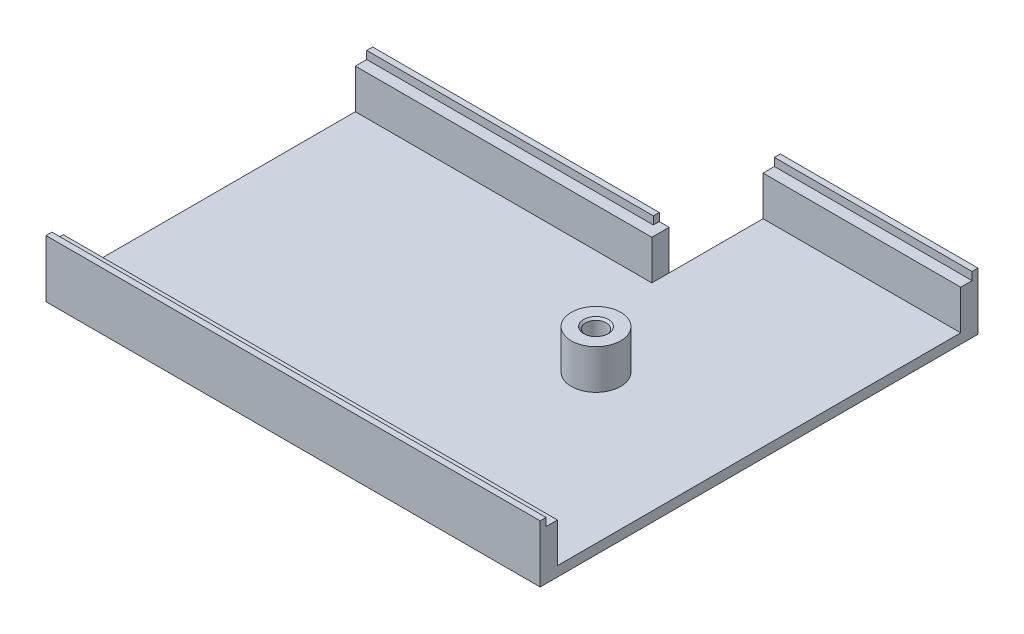
ISO-10303-21;
HEADER;
FILE_DESCRIPTION(('STEP AP214'),'2;1');
FILE_NAME('part.step','',(''),(''),'','','');
FILE_SCHEMA(('AUTOMOTIVE_DESIGN { 1 0 10303 214 1 1 1 1 }'));
ENDSEC;
DATA;
#1=APPLICATION_CONTEXT('core data for automotive mechanical design processes');
#2=APPLICATION_PROTOCOL_DEFINITION('international standard','automotive_design',2000,#1);
#3=PRODUCT_CONTEXT('',#1,'mechanical');
#4=PRODUCT('Part','Part','',(#3));
#5=PRODUCT_RELATED_PRODUCT_CATEGORY('part','',(#4));
#6=PRODUCT_DEFINITION_FORMATION('','',#4);
#7=PRODUCT_DEFINITION_CONTEXT('part definition',#1,'design');
#8=PRODUCT_DEFINITION('design','',#6,#7);
#9=PRODUCT_DEFINITION_SHAPE('','',#8);
#10=(LENGTH_UNIT() NAMED_UNIT(*) SI_UNIT(.MILLI.,.METRE.));
#11=(NAMED_UNIT(*) PLANE_ANGLE_UNIT() SI_UNIT($,.RADIAN.));
#12=(NAMED_UNIT(*) SI_UNIT($,.STERADIAN.) SOLID_ANGLE_UNIT());
#13=UNCERTAINTY_MEASURE_WITH_UNIT(LENGTH_MEASURE(1.E-05),#10,'distance_accuracy_value','');
#14=(GEOMETRIC_REPRESENTATION_CONTEXT(3) GLOBAL_UNCERTAINTY_ASSIGNED_CONTEXT((#13)) GLOBAL_UNIT_ASSIGNED_CONTEXT((#10,
#11,#12)) REPRESENTATION_CONTEXT('',''));
#15=CARTESIAN_POINT('',(0.,0.,0.));
#16=DIRECTION('',(0.,0.,1.));
#17=DIRECTION('',(1.,0.,0.));
#18=AXIS2_PLACEMENT_3D('',#15,#16,#17);
#19=CARTESIAN_POINT('',(0.,10.,0.));
#20=DIRECTION('',(0.,-1.,0.));
#21=DIRECTION('',(0.,0.,-1.));
#22=AXIS2_PLACEMENT_3D('',#19,#20,#21);
#23=PLANE('',#22);
#24=DIRECTION('',(-1.,0.,0.));
#25=VECTOR('',#24,1.);
#26=CARTESIAN_POINT('',(0.,10.,-1.20000000000001));
#27=LINE('',#26,#25);
#28=CARTESIAN_POINT('',(100.,10.,-1.20000000000001));
#29=VERTEX_POINT('',#28);
#30=CARTESIAN_POINT('',(0.,10.,-1.20000000000001));
#31=VERTEX_POINT('',#30);
#32=EDGE_CURVE('E57',#29,#31,#27,.T.);
#33=ORIENTED_EDGE('',*,*,#32,.F.);
#34=DIRECTION('',(0.,0.,-1.));
#35=VECTOR('',#34,1.);
#36=CARTESIAN_POINT('',(100.,10.,0.));
#37=LINE('',#36,#35);
#38=CARTESIAN_POINT('',(100.,10.,-3.5));
#39=VERTEX_POINT('',#38);
#40=EDGE_CURVE('E182',#29,#39,#37,.T.);
#41=ORIENTED_EDGE('',*,*,#40,.T.);
#42=DIRECTION('',(-1.,0.,0.));
#43=VECTOR('',#42,1.);
#44=CARTESIAN_POINT('',(0.,10.,-3.5));
#45=LINE('',#44,#43);
#46=CARTESIAN_POINT('',(0.,10.,-3.5));
#47=VERTEX_POINT('',#46);
#48=EDGE_CURVE('E176',#39,#47,#45,.T.);
#49=ORIENTED_EDGE('',*,*,#48,.T.);
#50=DIRECTION('',(0.,0.,1.));
#51=VECTOR('',#50,1.);
#52=CARTESIAN_POINT('',(0.,10.,0.));
#53=LINE('',#52,#51);
#54=EDGE_CURVE('E174',#47,#31,#53,.T.);
#55=ORIENTED_EDGE('',*,*,#54,.T.);
#56=EDGE_LOOP('',(#33,#41,#49,#55));
#57=FACE_BOUND('',#56,.T.);
#58=ADVANCED_FACE('F41',(#57),#23,.F.);
#59=CARTESIAN_POINT('',(0.,10.,0.));
#60=DIRECTION('',(0.,1.,0.));
#61=DIRECTION('',(0.,0.,1.));
#62=AXIS2_PLACEMENT_3D('',#59,#60,#61);
#63=PLANE('',#62);
#64=DIRECTION('',(0.,0.,-1.));
#65=VECTOR('',#64,1.);
#66=CARTESIAN_POINT('',(100.,10.,-88.6));
#67=LINE('',#66,#65);
#68=CARTESIAN_POINT('',(100.,10.,-85.1));
#69=VERTEX_POINT('',#68);
#70=CARTESIAN_POINT('',(100.,10.,-87.4));
#71=VERTEX_POINT('',#70);
#72=EDGE_CURVE('E65',#69,#71,#67,.T.);
#73=ORIENTED_EDGE('',*,*,#72,.T.);
#74=DIRECTION('',(1.,0.,0.));
#75=VECTOR('',#74,1.);
#76=CARTESIAN_POINT('',(60.,10.,-87.4));
#77=LINE('',#76,#75);
#78=CARTESIAN_POINT('',(60.,10.,-87.4));
#79=VERTEX_POINT('',#78);
#80=EDGE_CURVE('E215',#79,#71,#77,.T.);
#81=ORIENTED_EDGE('',*,*,#80,.F.);
#82=DIRECTION('',(0.,0.,1.));
#83=VECTOR('',#82,1.);
#84=CARTESIAN_POINT('',(60.,10.,-88.6));
#85=LINE('',#84,#83);
#86=CARTESIAN_POINT('',(60.,10.,-85.1));
#87=VERTEX_POINT('',#86);
#88=EDGE_CURVE('E280',#79,#87,#85,.T.);
#89=ORIENTED_EDGE('',*,*,#88,.T.);
#90=DIRECTION('',(1.,0.,0.));
#91=VECTOR('',#90,1.);
#92=CARTESIAN_POINT('',(60.,10.,-85.1));
#93=LINE('',#92,#91);
#94=EDGE_CURVE('E282',#87,#69,#93,.T.);
#95=ORIENTED_EDGE('',*,*,#94,.T.);
#96=EDGE_LOOP('',(#73,#81,#89,#95));
#97=FACE_BOUND('',#96,.T.);
#98=ADVANCED_FACE('F364',(#97),#63,.T.);
#99=CARTESIAN_POINT('',(0.,10.,0.));
#100=DIRECTION('',(0.,1.,0.));
#101=DIRECTION('',(0.,0.,1.));
#102=AXIS2_PLACEMENT_3D('',#99,#100,#101);
#103=PLANE('',#102);
#104=DIRECTION('',(0.,0.,-1.));
#105=VECTOR('',#104,1.);
#106=CARTESIAN_POINT('',(58.,10.,-66.1));
#107=LINE('',#106,#105);
#108=CARTESIAN_POINT('',(58.,10.,-64.9));
#109=VERTEX_POINT('',#108);
#110=CARTESIAN_POINT('',(58.,10.,-66.1));
#111=VERTEX_POINT('',#110);
#112=EDGE_CURVE('E232',#109,#111,#107,.T.);
#113=ORIENTED_EDGE('',*,*,#112,.F.);
#114=DIRECTION('',(1.,0.,0.));
#115=VECTOR('',#114,1.);
#116=CARTESIAN_POINT('',(0.,10.,-64.9));
#117=LINE('',#116,#115);
#118=CARTESIAN_POINT('',(0.,10.,-64.9));
#119=VERTEX_POINT('',#118);
#120=EDGE_CURVE('E217',#119,#109,#117,.T.);
#121=ORIENTED_EDGE('',*,*,#120,.F.);
#122=DIRECTION('',(0.,0.,1.));
#123=VECTOR('',#122,1.);
#124=CARTESIAN_POINT('',(0.,10.,-66.1));
#125=LINE('',#124,#123);
#126=CARTESIAN_POINT('',(0.,10.,-62.6));
#127=VERTEX_POINT('',#126);
#128=EDGE_CURVE('E285',#119,#127,#125,.T.);
#129=ORIENTED_EDGE('',*,*,#128,.T.);
#130=DIRECTION('',(1.,0.,0.));
#131=VECTOR('',#130,1.);
#132=CARTESIAN_POINT('',(0.,10.,-62.6));
#133=LINE('',#132,#131);
#134=CARTESIAN_POINT('',(60.,10.,-62.6));
#135=VERTEX_POINT('',#134);
#136=EDGE_CURVE('E287',#127,#135,#133,.T.);
#137=ORIENTED_EDGE('',*,*,#136,.T.);
#138=DIRECTION('',(0.,0.,-1.));
#139=VECTOR('',#138,1.);
#140=CARTESIAN_POINT('',(60.,10.,-66.1));
#141=LINE('',#140,#139);
#142=CARTESIAN_POINT('',(60.,10.,-66.1));
#143=VERTEX_POINT('',#142);
#144=EDGE_CURVE('E290',#135,#143,#141,.T.);
#145=ORIENTED_EDGE('',*,*,#144,.T.);
#146=DIRECTION('',(-1.,0.,0.));
#147=VECTOR('',#146,1.);
#148=CARTESIAN_POINT('',(0.,10.,-66.1));
#149=LINE('',#148,#147);
#150=EDGE_CURVE('E292',#143,#111,#149,.T.);
#151=ORIENTED_EDGE('',*,*,#150,.T.);
#152=EDGE_LOOP('',(#113,#121,#129,#137,#145,#151));
#153=FACE_BOUND('',#152,.T.);
#154=ADVANCED_FACE('F369',(#153),#103,.T.);
#155=CARTESIAN_POINT('',(0.,2.,0.));
#156=DIRECTION('',(0.,1.,0.));
#157=DIRECTION('',(0.,0.,1.));
#158=AXIS2_PLACEMENT_3D('',#155,#156,#157);
#159=PLANE('',#158);
#160=CARTESIAN_POINT('',(70.,2.,-41.3));
#161=DIRECTION('',(0.,1.,0.));
#162=DIRECTION('',(0.,0.,1.));
#163=AXIS2_PLACEMENT_3D('',#160,#161,#162);
#164=CIRCLE('',#163,5.00000000000001);
#165=CARTESIAN_POINT('',(70.,2.,-36.3));
#166=VERTEX_POINT('',#165);
#167=EDGE_CURVE('E256',#166,#166,#164,.T.);
#168=ORIENTED_EDGE('',*,*,#167,.F.);
#169=EDGE_LOOP('',(#168));
#170=FACE_BOUND('',#169,.T.);
#171=DIRECTION('',(0.,0.,1.));
#172=VECTOR('',#171,1.);
#173=CARTESIAN_POINT('',(0.,2.,-66.1));
#174=LINE('',#173,#172);
#175=CARTESIAN_POINT('',(0.,2.,-62.6));
#176=VERTEX_POINT('',#175);
#177=CARTESIAN_POINT('',(0.,2.,-3.5));
#178=VERTEX_POINT('',#177);
#179=EDGE_CURVE('E308',#176,#178,#174,.T.);
#180=ORIENTED_EDGE('',*,*,#179,.T.);
#181=DIRECTION('',(-1.,0.,0.));
#182=VECTOR('',#181,1.);
#183=CARTESIAN_POINT('',(0.,2.,-3.5));
#184=LINE('',#183,#182);
#185=CARTESIAN_POINT('',(100.,2.,-3.5));
#186=VERTEX_POINT('',#185);
#187=EDGE_CURVE('E181',#186,#178,#184,.T.);
#188=ORIENTED_EDGE('',*,*,#187,.F.);
#189=DIRECTION('',(0.,0.,-1.));
#190=VECTOR('',#189,1.);
#191=CARTESIAN_POINT('',(100.,2.,0.));
#192=LINE('',#191,#190);
#193=CARTESIAN_POINT('',(100.,2.,-85.1));
#194=VERTEX_POINT('',#193);
#195=EDGE_CURVE('E310',#186,#194,#192,.T.);
#196=ORIENTED_EDGE('',*,*,#195,.T.);
#197=DIRECTION('',(1.,0.,0.));
#198=VECTOR('',#197,1.);
#199=CARTESIAN_POINT('',(60.,2.,-85.1));
#200=LINE('',#199,#198);
#201=CARTESIAN_POINT('',(60.,2.,-85.1));
#202=VERTEX_POINT('',#201);
#203=EDGE_CURVE('E276',#202,#194,#200,.T.);
#204=ORIENTED_EDGE('',*,*,#203,.F.);
#205=DIRECTION('',(0.,0.,1.));
#206=VECTOR('',#205,1.);
#207=CARTESIAN_POINT('',(60.,2.,-88.6));
#208=LINE('',#207,#206);
#209=CARTESIAN_POINT('',(60.,2.,-66.1));
#210=VERTEX_POINT('',#209);
#211=EDGE_CURVE('E313',#202,#210,#208,.T.);
#212=ORIENTED_EDGE('',*,*,#211,.T.);
#213=DIRECTION('',(0.,0.,-1.));
#214=VECTOR('',#213,1.);
#215=CARTESIAN_POINT('',(60.,2.,-66.1));
#216=LINE('',#215,#214);
#217=CARTESIAN_POINT('',(60.,2.,-62.6));
#218=VERTEX_POINT('',#217);
#219=EDGE_CURVE('E288',#218,#210,#216,.T.);
#220=ORIENTED_EDGE('',*,*,#219,.F.);
#221=DIRECTION('',(1.,0.,0.));
#222=VECTOR('',#221,1.);
#223=CARTESIAN_POINT('',(0.,2.,-62.6));
#224=LINE('',#223,#222);
#225=EDGE_CURVE('E279',#176,#218,#224,.T.);
#226=ORIENTED_EDGE('',*,*,#225,.F.);
#227=EDGE_LOOP('',(#180,#188,#196,#204,#212,#220,#226));
#228=FACE_BOUND('',#227,.T.);
#229=ADVANCED_FACE('F382',(#170,#228),#159,.T.);
#230=CARTESIAN_POINT('',(60.,2.,-66.1));
#231=DIRECTION('',(0.,0.,1.));
#232=DIRECTION('',(1.,0.,0.));
#233=AXIS2_PLACEMENT_3D('',#230,#231,#232);
#234=PLANE('',#233);
#235=DIRECTION('',(-1.,0.,0.));
#236=VECTOR('',#235,1.);
#237=CARTESIAN_POINT('',(60.,0.,-66.1));
#238=LINE('',#237,#236);
#239=CARTESIAN_POINT('',(60.,0.,-66.1));
#240=VERTEX_POINT('',#239);
#241=CARTESIAN_POINT('',(0.,0.,-66.1));
#242=VERTEX_POINT('',#241);
#243=EDGE_CURVE('E307',#240,#242,#238,.T.);
#244=ORIENTED_EDGE('',*,*,#243,.T.);
#245=DIRECTION('',(0.,-1.,0.));
#246=VECTOR('',#245,1.);
#247=CARTESIAN_POINT('',(0.,2.,-66.1));
#248=LINE('',#247,#246);
#249=CARTESIAN_POINT('',(0.,11.6,-66.1));
#250=VERTEX_POINT('',#249);
#251=EDGE_CURVE('E341',#250,#242,#248,.T.);
#252=ORIENTED_EDGE('',*,*,#251,.F.);
#253=DIRECTION('',(-1.,0.,0.));
#254=VECTOR('',#253,1.);
#255=CARTESIAN_POINT('',(0.,11.6,-66.1));
#256=LINE('',#255,#254);
#257=CARTESIAN_POINT('',(58.,11.6,-66.1));
#258=VERTEX_POINT('',#257);
#259=EDGE_CURVE('E236',#258,#250,#256,.T.);
#260=ORIENTED_EDGE('',*,*,#259,.F.);
#261=DIRECTION('',(0.,-1.,0.));
#262=VECTOR('',#261,1.);
#263=CARTESIAN_POINT('',(58.,11.6,-66.1));
#264=LINE('',#263,#262);
#265=EDGE_CURVE('E239',#258,#111,#264,.T.);
#266=ORIENTED_EDGE('',*,*,#265,.T.);
#267=ORIENTED_EDGE('',*,*,#150,.F.);
#268=DIRECTION('',(0.,-1.,0.));
#269=VECTOR('',#268,1.);
#270=CARTESIAN_POINT('',(60.,10.,-66.1));
#271=LINE('',#270,#269);
#272=EDGE_CURVE('E294',#143,#210,#271,.T.);
#273=ORIENTED_EDGE('',*,*,#272,.T.);
#274=DIRECTION('',(0.,-1.,0.));
#275=VECTOR('',#274,1.);
#276=CARTESIAN_POINT('',(60.,2.,-66.1));
#277=LINE('',#276,#275);
#278=EDGE_CURVE('E315',#210,#240,#277,.T.);
#279=ORIENTED_EDGE('',*,*,#278,.T.);
#280=EDGE_LOOP('',(#244,#252,#260,#266,#267,#273,#279));
#281=FACE_BOUND('',#280,.T.);
#282=ADVANCED_FACE('F394',(#281),#234,.F.);
#283=CARTESIAN_POINT('',(0.,2.,-66.1));
#284=DIRECTION('',(1.,0.,0.));
#285=DIRECTION('',(0.,0.,-1.));
#286=AXIS2_PLACEMENT_3D('',#283,#284,#285);
#287=PLANE('',#286);
#288=DIRECTION('',(0.,0.,1.));
#289=VECTOR('',#288,1.);
#290=CARTESIAN_POINT('',(0.,0.,-66.1));
#291=LINE('',#290,#289);
#292=CARTESIAN_POINT('',(0.,0.,0.));
#293=VERTEX_POINT('',#292);
#294=EDGE_CURVE('E318',#242,#293,#291,.T.);
#295=ORIENTED_EDGE('',*,*,#294,.T.);
#296=DIRECTION('',(0.,-1.,0.));
#297=VECTOR('',#296,1.);
#298=CARTESIAN_POINT('',(0.,2.,0.));
#299=LINE('',#298,#297);
#300=CARTESIAN_POINT('',(0.,11.6,0.));
#301=VERTEX_POINT('',#300);
#302=EDGE_CURVE('E338',#301,#293,#299,.T.);
#303=ORIENTED_EDGE('',*,*,#302,.F.);
#304=DIRECTION('',(0.,0.,1.));
#305=VECTOR('',#304,1.);
#306=CARTESIAN_POINT('',(0.,11.6,0.));
#307=LINE('',#306,#305);
#308=CARTESIAN_POINT('',(0.,11.6,-1.20000000000001));
#309=VERTEX_POINT('',#308);
#310=EDGE_CURVE('E194',#309,#301,#307,.T.);
#311=ORIENTED_EDGE('',*,*,#310,.F.);
#312=DIRECTION('',(0.,-1.,0.));
#313=VECTOR('',#312,1.);
#314=CARTESIAN_POINT('',(0.,11.6,-1.20000000000001));
#315=LINE('',#314,#313);
#316=EDGE_CURVE('E189',#309,#31,#315,.T.);
#317=ORIENTED_EDGE('',*,*,#316,.T.);
#318=ORIENTED_EDGE('',*,*,#54,.F.);
#319=DIRECTION('',(0.,-1.,0.));
#320=VECTOR('',#319,1.);
#321=CARTESIAN_POINT('',(0.,10.,-3.5));
#322=LINE('',#321,#320);
#323=EDGE_CURVE('E264',#47,#178,#322,.T.);
#324=ORIENTED_EDGE('',*,*,#323,.T.);
#325=ORIENTED_EDGE('',*,*,#179,.F.);
#326=DIRECTION('',(0.,-1.,0.));
#327=VECTOR('',#326,1.);
#328=CARTESIAN_POINT('',(0.,10.,-62.6));
#329=LINE('',#328,#327);
#330=EDGE_CURVE('E304',#127,#176,#329,.T.);
#331=ORIENTED_EDGE('',*,*,#330,.F.);
#332=ORIENTED_EDGE('',*,*,#128,.F.);
#333=DIRECTION('',(0.,-1.,0.));
#334=VECTOR('',#333,1.);
#335=CARTESIAN_POINT('',(0.,11.6,-64.9));
#336=LINE('',#335,#334);
#337=CARTESIAN_POINT('',(0.,11.6,-64.9));
#338=VERTEX_POINT('',#337);
#339=EDGE_CURVE('E249',#338,#119,#336,.T.);
#340=ORIENTED_EDGE('',*,*,#339,.F.);
#341=DIRECTION('',(0.,0.,1.));
#342=VECTOR('',#341,1.);
#343=CARTESIAN_POINT('',(0.,11.6,-66.1));
#344=LINE('',#343,#342);
#345=EDGE_CURVE('E228',#250,#338,#344,.T.);
#346=ORIENTED_EDGE('',*,*,#345,.F.);
#347=ORIENTED_EDGE('',*,*,#251,.T.);
#348=EDGE_LOOP('',(#295,#303,#311,#317,#318,#324,#325,#331,#332,#340,#346,#347));
#349=FACE_BOUND('',#348,.T.);
#350=ADVANCED_FACE('F196',(#349),#287,.F.);
#351=CARTESIAN_POINT('',(0.,2.,0.));
#352=DIRECTION('',(0.,0.,-1.));
#353=DIRECTION('',(-1.,0.,0.));
#354=AXIS2_PLACEMENT_3D('',#351,#352,#353);
#355=PLANE('',#354);
#356=DIRECTION('',(1.,0.,0.));
#357=VECTOR('',#356,1.);
#358=CARTESIAN_POINT('',(0.,0.,0.));
#359=LINE('',#358,#357);
#360=CARTESIAN_POINT('',(100.,0.,0.));
#361=VERTEX_POINT('',#360);
#362=EDGE_CURVE('E320',#293,#361,#359,.T.);
#363=ORIENTED_EDGE('',*,*,#362,.T.);
#364=DIRECTION('',(0.,-1.,0.));
#365=VECTOR('',#364,1.);
#366=CARTESIAN_POINT('',(100.,2.,0.));
#367=LINE('',#366,#365);
#368=CARTESIAN_POINT('',(100.,11.6,0.));
#369=VERTEX_POINT('',#368);
#370=EDGE_CURVE('E335',#369,#361,#367,.T.);
#371=ORIENTED_EDGE('',*,*,#370,.F.);
#372=DIRECTION('',(1.,0.,0.));
#373=VECTOR('',#372,1.);
#374=CARTESIAN_POINT('',(0.,11.6,0.));
#375=LINE('',#374,#373);
#376=EDGE_CURVE('E205',#301,#369,#375,.T.);
#377=ORIENTED_EDGE('',*,*,#376,.F.);
#378=ORIENTED_EDGE('',*,*,#302,.T.);
#379=EDGE_LOOP('',(#363,#371,#377,#378));
#380=FACE_BOUND('',#379,.T.);
#381=ADVANCED_FACE('F410',(#380),#355,.F.);
#382=CARTESIAN_POINT('',(100.,2.,0.));
#383=DIRECTION('',(-1.,0.,0.));
#384=DIRECTION('',(0.,0.,1.));
#385=AXIS2_PLACEMENT_3D('',#382,#383,#384);
#386=PLANE('',#385);
#387=DIRECTION('',(0.,0.,-1.));
#388=VECTOR('',#387,1.);
#389=CARTESIAN_POINT('',(100.,0.,0.));
#390=LINE('',#389,#388);
#391=CARTESIAN_POINT('',(100.,0.,-88.6));
#392=VERTEX_POINT('',#391);
#393=EDGE_CURVE('E322',#361,#392,#390,.T.);
#394=ORIENTED_EDGE('',*,*,#393,.T.);
#395=DIRECTION('',(0.,-1.,0.));
#396=VECTOR('',#395,1.);
#397=CARTESIAN_POINT('',(100.,2.,-88.6));
#398=LINE('',#397,#396);
#399=CARTESIAN_POINT('',(100.,11.6,-88.6));
#400=VERTEX_POINT('',#399);
#401=EDGE_CURVE('E332',#400,#392,#398,.T.);
#402=ORIENTED_EDGE('',*,*,#401,.F.);
#403=DIRECTION('',(0.,0.,-1.));
#404=VECTOR('',#403,1.);
#405=CARTESIAN_POINT('',(100.,11.6,-88.6));
#406=LINE('',#405,#404);
#407=CARTESIAN_POINT('',(100.,11.6,-87.4));
#408=VERTEX_POINT('',#407);
#409=EDGE_CURVE('E221',#408,#400,#406,.T.);
#410=ORIENTED_EDGE('',*,*,#409,.F.);
#411=DIRECTION('',(0.,-1.,0.));
#412=VECTOR('',#411,1.);
#413=CARTESIAN_POINT('',(100.,11.6,-87.4));
#414=LINE('',#413,#412);
#415=EDGE_CURVE('E211',#408,#71,#414,.T.);
#416=ORIENTED_EDGE('',*,*,#415,.T.);
#417=ORIENTED_EDGE('',*,*,#72,.F.);
#418=DIRECTION('',(0.,-1.,0.));
#419=VECTOR('',#418,1.);
#420=CARTESIAN_POINT('',(100.,10.,-85.1));
#421=LINE('',#420,#419);
#422=EDGE_CURVE('E273',#69,#194,#421,.T.);
#423=ORIENTED_EDGE('',*,*,#422,.T.);
#424=ORIENTED_EDGE('',*,*,#195,.F.);
#425=DIRECTION('',(0.,-1.,0.));
#426=VECTOR('',#425,1.);
#427=CARTESIAN_POINT('',(100.,10.,-3.5));
#428=LINE('',#427,#426);
#429=EDGE_CURVE('E259',#39,#186,#428,.T.);
#430=ORIENTED_EDGE('',*,*,#429,.F.);
#431=ORIENTED_EDGE('',*,*,#40,.F.);
#432=DIRECTION('',(0.,-1.,0.));
#433=VECTOR('',#432,1.);
#434=CARTESIAN_POINT('',(100.,11.6,-1.20000000000001));
#435=LINE('',#434,#433);
#436=CARTESIAN_POINT('',(100.,11.6,-1.20000000000001));
#437=VERTEX_POINT('',#436);
#438=EDGE_CURVE('E192',#437,#29,#435,.T.);
#439=ORIENTED_EDGE('',*,*,#438,.F.);
#440=DIRECTION('',(0.,0.,-1.));
#441=VECTOR('',#440,1.);
#442=CARTESIAN_POINT('',(100.,11.6,0.));
#443=LINE('',#442,#441);
#444=EDGE_CURVE('E200',#369,#437,#443,.T.);
#445=ORIENTED_EDGE('',*,*,#444,.F.);
#446=ORIENTED_EDGE('',*,*,#370,.T.);
#447=EDGE_LOOP('',(#394,#402,#410,#416,#417,#423,#424,#430,#431,#439,#445,#446));
#448=FACE_BOUND('',#447,.T.);
#449=ADVANCED_FACE('F406',(#448),#386,.F.);
#450=CARTESIAN_POINT('',(100.,2.,-88.6));
#451=DIRECTION('',(0.,0.,1.));
#452=DIRECTION('',(1.,0.,0.));
#453=AXIS2_PLACEMENT_3D('',#450,#451,#452);
#454=PLANE('',#453);
#455=DIRECTION('',(-1.,0.,0.));
#456=VECTOR('',#455,1.);
#457=CARTESIAN_POINT('',(100.,0.,-88.6));
#458=LINE('',#457,#456);
#459=CARTESIAN_POINT('',(60.,0.,-88.6));
#460=VERTEX_POINT('',#459);
#461=EDGE_CURVE('E324',#392,#460,#458,.T.);
#462=ORIENTED_EDGE('',*,*,#461,.T.);
#463=DIRECTION('',(0.,-1.,0.));
#464=VECTOR('',#463,1.);
#465=CARTESIAN_POINT('',(60.,2.,-88.6));
#466=LINE('',#465,#464);
#467=CARTESIAN_POINT('',(60.,11.6,-88.6));
#468=VERTEX_POINT('',#467);
#469=EDGE_CURVE('E329',#468,#460,#466,.T.);
#470=ORIENTED_EDGE('',*,*,#469,.F.);
#471=DIRECTION('',(-1.,0.,0.));
#472=VECTOR('',#471,1.);
#473=CARTESIAN_POINT('',(60.,11.6,-88.6));
#474=LINE('',#473,#472);
#475=EDGE_CURVE('E214',#400,#468,#474,.T.);
#476=ORIENTED_EDGE('',*,*,#475,.F.);
#477=ORIENTED_EDGE('',*,*,#401,.T.);
#478=EDGE_LOOP('',(#462,#470,#476,#477));
#479=FACE_BOUND('',#478,.T.);
#480=ADVANCED_FACE('F402',(#479),#454,.F.);
#481=CARTESIAN_POINT('',(60.,2.,-88.6));
#482=DIRECTION('',(1.,0.,0.));
#483=DIRECTION('',(0.,0.,-1.));
#484=AXIS2_PLACEMENT_3D('',#481,#482,#483);
#485=PLANE('',#484);
#486=DIRECTION('',(0.,0.,1.));
#487=VECTOR('',#486,1.);
#488=CARTESIAN_POINT('',(60.,0.,-88.6));
#489=LINE('',#488,#487);
#490=EDGE_CURVE('E311',#460,#240,#489,.T.);
#491=ORIENTED_EDGE('',*,*,#490,.T.);
#492=ORIENTED_EDGE('',*,*,#278,.F.);
#493=ORIENTED_EDGE('',*,*,#211,.F.);
#494=DIRECTION('',(0.,-1.,0.));
#495=VECTOR('',#494,1.);
#496=CARTESIAN_POINT('',(60.,10.,-85.1));
#497=LINE('',#496,#495);
#498=EDGE_CURVE('E268',#87,#202,#497,.T.);
#499=ORIENTED_EDGE('',*,*,#498,.F.);
#500=ORIENTED_EDGE('',*,*,#88,.F.);
#501=DIRECTION('',(0.,-1.,0.));
#502=VECTOR('',#501,1.);
#503=CARTESIAN_POINT('',(60.,11.6,-87.4));
#504=LINE('',#503,#502);
#505=CARTESIAN_POINT('',(60.,11.6,-87.4));
#506=VERTEX_POINT('',#505);
#507=EDGE_CURVE('E193',#506,#79,#504,.T.);
#508=ORIENTED_EDGE('',*,*,#507,.F.);
#509=DIRECTION('',(0.,0.,1.));
#510=VECTOR('',#509,1.);
#511=CARTESIAN_POINT('',(60.,11.6,-88.6));
#512=LINE('',#511,#510);
#513=EDGE_CURVE('E218',#468,#506,#512,.T.);
#514=ORIENTED_EDGE('',*,*,#513,.F.);
#515=ORIENTED_EDGE('',*,*,#469,.T.);
#516=EDGE_LOOP('',(#491,#492,#493,#499,#500,#508,#514,#515));
#517=FACE_BOUND('',#516,.T.);
#518=ADVANCED_FACE('F398',(#517),#485,.F.);
#519=CARTESIAN_POINT('',(0.,0.,0.));
#520=DIRECTION('',(0.,1.,0.));
#521=DIRECTION('',(0.,0.,1.));
#522=AXIS2_PLACEMENT_3D('',#519,#520,#521);
#523=PLANE('',#522);
#524=ORIENTED_EDGE('',*,*,#243,.F.);
#525=ORIENTED_EDGE('',*,*,#490,.F.);
#526=ORIENTED_EDGE('',*,*,#461,.F.);
#527=ORIENTED_EDGE('',*,*,#393,.F.);
#528=ORIENTED_EDGE('',*,*,#362,.F.);
#529=ORIENTED_EDGE('',*,*,#294,.F.);
#530=EDGE_LOOP('',(#524,#525,#526,#527,#528,#529));
#531=FACE_BOUND('',#530,.T.);
#532=ADVANCED_FACE('F390',(#531),#523,.F.);
#533=CARTESIAN_POINT('',(0.,10.,-62.6));
#534=DIRECTION('',(0.,0.,-1.));
#535=DIRECTION('',(-1.,0.,0.));
#536=AXIS2_PLACEMENT_3D('',#533,#534,#535);
#537=PLANE('',#536);
#538=ORIENTED_EDGE('',*,*,#225,.T.);
#539=DIRECTION('',(0.,-1.,0.));
#540=VECTOR('',#539,1.);
#541=CARTESIAN_POINT('',(60.,10.,-62.6));
#542=LINE('',#541,#540);
#543=EDGE_CURVE('E301',#135,#218,#542,.T.);
#544=ORIENTED_EDGE('',*,*,#543,.F.);
#545=ORIENTED_EDGE('',*,*,#136,.F.);
#546=ORIENTED_EDGE('',*,*,#330,.T.);
#547=EDGE_LOOP('',(#538,#544,#545,#546));
#548=FACE_BOUND('',#547,.T.);
#549=ADVANCED_FACE('F386',(#548),#537,.F.);
#550=CARTESIAN_POINT('',(60.,10.,-66.1));
#551=DIRECTION('',(-1.,0.,0.));
#552=DIRECTION('',(0.,0.,1.));
#553=AXIS2_PLACEMENT_3D('',#550,#551,#552);
#554=PLANE('',#553);
#555=ORIENTED_EDGE('',*,*,#219,.T.);
#556=ORIENTED_EDGE('',*,*,#272,.F.);
#557=ORIENTED_EDGE('',*,*,#144,.F.);
#558=ORIENTED_EDGE('',*,*,#543,.T.);
#559=EDGE_LOOP('',(#555,#556,#557,#558));
#560=FACE_BOUND('',#559,.T.);
#561=ADVANCED_FACE('F377',(#560),#554,.F.);
#562=CARTESIAN_POINT('',(60.,10.,-85.1));
#563=DIRECTION('',(0.,0.,-1.));
#564=DIRECTION('',(-1.,0.,0.));
#565=AXIS2_PLACEMENT_3D('',#562,#563,#564);
#566=PLANE('',#565);
#567=ORIENTED_EDGE('',*,*,#203,.T.);
#568=ORIENTED_EDGE('',*,*,#422,.F.);
#569=ORIENTED_EDGE('',*,*,#94,.F.);
#570=ORIENTED_EDGE('',*,*,#498,.T.);
#571=EDGE_LOOP('',(#567,#568,#569,#570));
#572=FACE_BOUND('',#571,.T.);
#573=ADVANCED_FACE('F375',(#572),#566,.F.);
#574=CARTESIAN_POINT('',(0.,10.,-3.5));
#575=DIRECTION('',(0.,0.,1.));
#576=DIRECTION('',(1.,0.,0.));
#577=AXIS2_PLACEMENT_3D('',#574,#575,#576);
#578=PLANE('',#577);
#579=ORIENTED_EDGE('',*,*,#187,.T.);
#580=ORIENTED_EDGE('',*,*,#323,.F.);
#581=ORIENTED_EDGE('',*,*,#48,.F.);
#582=ORIENTED_EDGE('',*,*,#429,.T.);
#583=EDGE_LOOP('',(#579,#580,#581,#582));
#584=FACE_BOUND('',#583,.T.);
#585=ADVANCED_FACE('F373',(#584),#578,.F.);
#586=CARTESIAN_POINT('',(70.,10.,-41.3));
#587=DIRECTION('',(0.,-1.,0.));
#588=DIRECTION('',(0.,0.,-1.));
#589=AXIS2_PLACEMENT_3D('',#586,#587,#588);
#590=CYLINDRICAL_SURFACE('',#589,5.00000000000001);
#591=CARTESIAN_POINT('',(70.,10.,-41.3));
#592=DIRECTION('',(0.,1.,0.));
#593=DIRECTION('',(0.,0.,1.));
#594=AXIS2_PLACEMENT_3D('',#591,#592,#593);
#595=CIRCLE('',#594,5.00000000000001);
#596=CARTESIAN_POINT('',(70.,10.,-36.3));
#597=VERTEX_POINT('',#596);
#598=EDGE_CURVE('E255',#597,#597,#595,.T.);
#599=ORIENTED_EDGE('',*,*,#598,.F.);
#600=EDGE_LOOP('',(#599));
#601=FACE_BOUND('',#600,.T.);
#602=ORIENTED_EDGE('',*,*,#167,.T.);
#603=EDGE_LOOP('',(#602));
#604=FACE_BOUND('',#603,.T.);
#605=ADVANCED_FACE('F483',(#601,#604),#590,.T.);
#606=CARTESIAN_POINT('',(70.,10.,-41.3));
#607=DIRECTION('',(0.,1.,0.));
#608=DIRECTION('',(0.,0.,1.));
#609=AXIS2_PLACEMENT_3D('',#606,#607,#608);
#610=PLANE('',#609);
#611=CARTESIAN_POINT('',(70.,10.,-41.3));
#612=DIRECTION('',(0.,1.,0.));
#613=DIRECTION('',(0.,0.,1.));
#614=AXIS2_PLACEMENT_3D('',#611,#612,#613);
#615=CIRCLE('',#614,2.49999999999996);
#616=CARTESIAN_POINT('',(70.,10.,-38.8));
#617=VERTEX_POINT('',#616);
#618=EDGE_CURVE('E11',#617,#617,#615,.F.);
#619=ORIENTED_EDGE('',*,*,#618,.T.);
#620=EDGE_LOOP('',(#619));
#621=FACE_BOUND('',#620,.T.);
#622=ORIENTED_EDGE('',*,*,#598,.T.);
#623=EDGE_LOOP('',(#622));
#624=FACE_BOUND('',#623,.T.);
#625=ADVANCED_FACE('F482',(#621,#624),#610,.T.);
#626=CARTESIAN_POINT('',(70.,1.,-41.3));
#627=DIRECTION('',(0.,1.,0.));
#628=DIRECTION('',(0.,0.,1.));
#629=AXIS2_PLACEMENT_3D('',#626,#627,#628);
#630=CYLINDRICAL_SURFACE('',#629,2.1);
#631=CARTESIAN_POINT('',(70.,9.60000000000005,-41.3));
#632=DIRECTION('',(0.,1.,0.));
#633=DIRECTION('',(0.,0.,1.));
#634=AXIS2_PLACEMENT_3D('',#631,#632,#633);
#635=CIRCLE('',#634,2.1);
#636=CARTESIAN_POINT('',(70.,9.60000000000005,-39.2));
#637=VERTEX_POINT('',#636);
#638=EDGE_CURVE('E50',#637,#637,#635,.T.);
#639=ORIENTED_EDGE('',*,*,#638,.T.);
#640=EDGE_LOOP('',(#639));
#641=FACE_BOUND('',#640,.T.);
#642=CARTESIAN_POINT('',(70.,1.,-41.3));
#643=DIRECTION('',(0.,1.,0.));
#644=DIRECTION('',(0.,0.,1.));
#645=AXIS2_PLACEMENT_3D('',#642,#643,#644);
#646=CIRCLE('',#645,2.1);
#647=CARTESIAN_POINT('',(70.,1.,-39.2));
#648=VERTEX_POINT('',#647);
#649=EDGE_CURVE('E252',#648,#648,#646,.T.);
#650=ORIENTED_EDGE('',*,*,#649,.F.);
#651=EDGE_LOOP('',(#650));
#652=FACE_BOUND('',#651,.T.);
#653=ADVANCED_FACE('F346',(#641,#652),#630,.F.);
#654=CARTESIAN_POINT('',(70.,1.,-41.3));
#655=DIRECTION('',(0.,1.,0.));
#656=DIRECTION('',(0.,0.,1.));
#657=AXIS2_PLACEMENT_3D('',#654,#655,#656);
#658=PLANE('',#657);
#659=ORIENTED_EDGE('',*,*,#649,.T.);
#660=EDGE_LOOP('',(#659));
#661=FACE_BOUND('',#660,.T.);
#662=ADVANCED_FACE('F351',(#661),#658,.T.);
#663=CARTESIAN_POINT('',(70.,9.60000000000005,-41.3));
#664=DIRECTION('',(0.,1.,0.));
#665=DIRECTION('',(0.,0.,1.));
#666=AXIS2_PLACEMENT_3D('',#663,#664,#665);
#667=CONICAL_SURFACE('',#666,2.1,0.785398163397452);
#668=ORIENTED_EDGE('',*,*,#618,.F.);
#669=EDGE_LOOP('',(#668));
#670=FACE_BOUND('',#669,.T.);
#671=ORIENTED_EDGE('',*,*,#638,.F.);
#672=EDGE_LOOP('',(#671));
#673=FACE_BOUND('',#672,.T.);
#674=ADVANCED_FACE('F44',(#670,#673),#667,.F.);
#675=CARTESIAN_POINT('',(0.,11.6,-64.9));
#676=DIRECTION('',(0.,0.,-1.));
#677=DIRECTION('',(-1.,0.,0.));
#678=AXIS2_PLACEMENT_3D('',#675,#676,#677);
#679=PLANE('',#678);
#680=ORIENTED_EDGE('',*,*,#120,.T.);
#681=DIRECTION('',(0.,-1.,0.));
#682=VECTOR('',#681,1.);
#683=CARTESIAN_POINT('',(58.,11.6,-64.9));
#684=LINE('',#683,#682);
#685=CARTESIAN_POINT('',(58.,11.6,-64.9));
#686=VERTEX_POINT('',#685);
#687=EDGE_CURVE('E246',#686,#109,#684,.T.);
#688=ORIENTED_EDGE('',*,*,#687,.F.);
#689=DIRECTION('',(1.,0.,0.));
#690=VECTOR('',#689,1.);
#691=CARTESIAN_POINT('',(0.,11.6,-64.9));
#692=LINE('',#691,#690);
#693=EDGE_CURVE('E231',#338,#686,#692,.T.);
#694=ORIENTED_EDGE('',*,*,#693,.F.);
#695=ORIENTED_EDGE('',*,*,#339,.T.);
#696=EDGE_LOOP('',(#680,#688,#694,#695));
#697=FACE_BOUND('',#696,.T.);
#698=ADVANCED_FACE('F350',(#697),#679,.F.);
#699=CARTESIAN_POINT('',(58.,11.6,-66.1));
#700=DIRECTION('',(-1.,0.,0.));
#701=DIRECTION('',(0.,0.,1.));
#702=AXIS2_PLACEMENT_3D('',#699,#700,#701);
#703=PLANE('',#702);
#704=ORIENTED_EDGE('',*,*,#112,.T.);
#705=ORIENTED_EDGE('',*,*,#265,.F.);
#706=DIRECTION('',(0.,0.,-1.));
#707=VECTOR('',#706,1.);
#708=CARTESIAN_POINT('',(58.,11.6,-66.1));
#709=LINE('',#708,#707);
#710=EDGE_CURVE('E234',#686,#258,#709,.T.);
#711=ORIENTED_EDGE('',*,*,#710,.F.);
#712=ORIENTED_EDGE('',*,*,#687,.T.);
#713=EDGE_LOOP('',(#704,#705,#711,#712));
#714=FACE_BOUND('',#713,.T.);
#715=ADVANCED_FACE('F357',(#714),#703,.F.);
#716=CARTESIAN_POINT('',(0.,11.6,0.));
#717=DIRECTION('',(0.,1.,0.));
#718=DIRECTION('',(0.,0.,1.));
#719=AXIS2_PLACEMENT_3D('',#716,#717,#718);
#720=PLANE('',#719);
#721=ORIENTED_EDGE('',*,*,#345,.T.);
#722=ORIENTED_EDGE('',*,*,#693,.T.);
#723=ORIENTED_EDGE('',*,*,#710,.T.);
#724=ORIENTED_EDGE('',*,*,#259,.T.);
#725=EDGE_LOOP('',(#721,#722,#723,#724));
#726=FACE_BOUND('',#725,.T.);
#727=ADVANCED_FACE('F431',(#726),#720,.T.);
#728=CARTESIAN_POINT('',(60.,11.6,-87.4));
#729=DIRECTION('',(0.,0.,-1.));
#730=DIRECTION('',(-1.,0.,0.));
#731=AXIS2_PLACEMENT_3D('',#728,#729,#730);
#732=PLANE('',#731);
#733=ORIENTED_EDGE('',*,*,#80,.T.);
#734=ORIENTED_EDGE('',*,*,#415,.F.);
#735=DIRECTION('',(1.,0.,0.));
#736=VECTOR('',#735,1.);
#737=CARTESIAN_POINT('',(60.,11.6,-87.4));
#738=LINE('',#737,#736);
#739=EDGE_CURVE('E224',#506,#408,#738,.T.);
#740=ORIENTED_EDGE('',*,*,#739,.F.);
#741=ORIENTED_EDGE('',*,*,#507,.T.);
#742=EDGE_LOOP('',(#733,#734,#740,#741));
#743=FACE_BOUND('',#742,.T.);
#744=ADVANCED_FACE('F470',(#743),#732,.F.);
#745=CARTESIAN_POINT('',(0.,11.6,0.));
#746=DIRECTION('',(0.,1.,0.));
#747=DIRECTION('',(0.,0.,1.));
#748=AXIS2_PLACEMENT_3D('',#745,#746,#747);
#749=PLANE('',#748);
#750=ORIENTED_EDGE('',*,*,#513,.T.);
#751=ORIENTED_EDGE('',*,*,#739,.T.);
#752=ORIENTED_EDGE('',*,*,#409,.T.);
#753=ORIENTED_EDGE('',*,*,#475,.T.);
#754=EDGE_LOOP('',(#750,#751,#752,#753));
#755=FACE_BOUND('',#754,.T.);
#756=ADVANCED_FACE('F456',(#755),#749,.T.);
#757=CARTESIAN_POINT('',(0.,11.6,-1.20000000000001));
#758=DIRECTION('',(0.,0.,1.));
#759=DIRECTION('',(1.,0.,0.));
#760=AXIS2_PLACEMENT_3D('',#757,#758,#759);
#761=PLANE('',#760);
#762=ORIENTED_EDGE('',*,*,#32,.T.);
#763=ORIENTED_EDGE('',*,*,#316,.F.);
#764=DIRECTION('',(-1.,0.,0.));
#765=VECTOR('',#764,1.);
#766=CARTESIAN_POINT('',(0.,11.6,-1.20000000000001));
#767=LINE('',#766,#765);
#768=EDGE_CURVE('E198',#437,#309,#767,.T.);
#769=ORIENTED_EDGE('',*,*,#768,.F.);
#770=ORIENTED_EDGE('',*,*,#438,.T.);
#771=EDGE_LOOP('',(#762,#763,#769,#770));
#772=FACE_BOUND('',#771,.T.);
#773=ADVANCED_FACE('F187',(#772),#761,.F.);
#774=CARTESIAN_POINT('',(0.,11.6,0.));
#775=DIRECTION('',(0.,-1.,0.));
#776=DIRECTION('',(0.,0.,-1.));
#777=AXIS2_PLACEMENT_3D('',#774,#775,#776);
#778=PLANE('',#777);
#779=ORIENTED_EDGE('',*,*,#310,.T.);
#780=ORIENTED_EDGE('',*,*,#376,.T.);
#781=ORIENTED_EDGE('',*,*,#444,.T.);
#782=ORIENTED_EDGE('',*,*,#768,.T.);
#783=EDGE_LOOP('',(#779,#780,#781,#782));
#784=FACE_BOUND('',#783,.T.);
#785=ADVANCED_FACE('F462',(#784),#778,.F.);
#786=CLOSED_SHELL('',(#58,#98,#154,#229,#282,#350,#381,#449,#480,#518,#532,#549,#561,#573,#585,
#605,#625,#653,#662,#674,#698,#715,#727,#744,#756,#773,#785));
#787=MANIFOLD_SOLID_BREP('B2',#786);
#788=ADVANCED_BREP_SHAPE_REPRESENTATION('',(#18,#787),#14);
#789=SHAPE_DEFINITION_REPRESENTATION(#9,#788);
ENDSEC;
END-ISO-10303-21;
